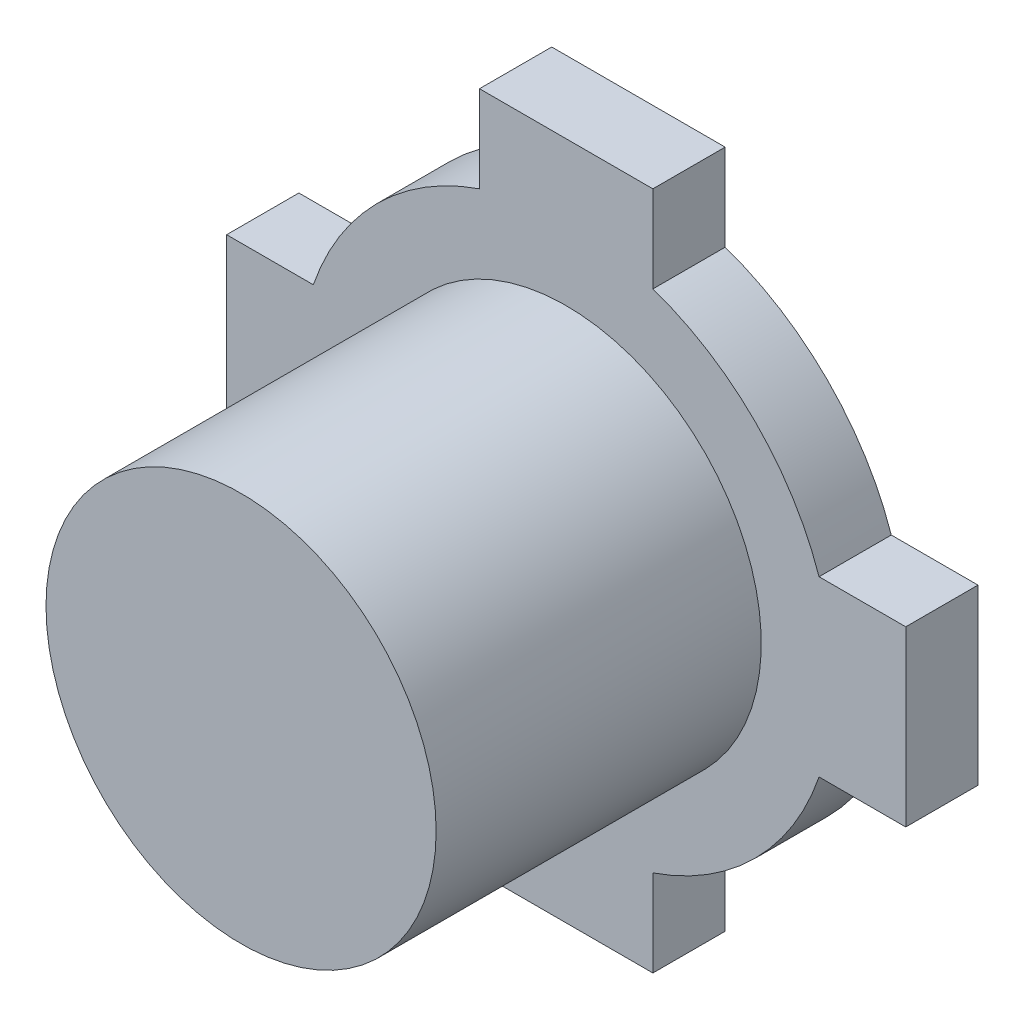
ISO-10303-21;
HEADER;
FILE_DESCRIPTION(('STEP AP214'),'2;1');
FILE_NAME('part.step','',(''),(''),'','','');
FILE_SCHEMA(('AUTOMOTIVE_DESIGN { 1 0 10303 214 1 1 1 1 }'));
ENDSEC;
DATA;
#1=APPLICATION_CONTEXT('core data for automotive mechanical design processes');
#2=APPLICATION_PROTOCOL_DEFINITION('international standard','automotive_design',2000,#1);
#3=PRODUCT_CONTEXT('',#1,'mechanical');
#4=PRODUCT('Part','Part','',(#3));
#5=PRODUCT_RELATED_PRODUCT_CATEGORY('part','',(#4));
#6=PRODUCT_DEFINITION_FORMATION('','',#4);
#7=PRODUCT_DEFINITION_CONTEXT('part definition',#1,'design');
#8=PRODUCT_DEFINITION('design','',#6,#7);
#9=PRODUCT_DEFINITION_SHAPE('','',#8);
#10=(LENGTH_UNIT() NAMED_UNIT(*) SI_UNIT(.MILLI.,.METRE.));
#11=(NAMED_UNIT(*) PLANE_ANGLE_UNIT() SI_UNIT($,.RADIAN.));
#12=(NAMED_UNIT(*) SI_UNIT($,.STERADIAN.) SOLID_ANGLE_UNIT());
#13=UNCERTAINTY_MEASURE_WITH_UNIT(LENGTH_MEASURE(1.E-05),#10,'distance_accuracy_value','');
#14=(GEOMETRIC_REPRESENTATION_CONTEXT(3) GLOBAL_UNCERTAINTY_ASSIGNED_CONTEXT((#13)) GLOBAL_UNIT_ASSIGNED_CONTEXT((#10,
#11,#12)) REPRESENTATION_CONTEXT('',''));
#15=CARTESIAN_POINT('',(0.,0.,0.));
#16=DIRECTION('',(0.,0.,1.));
#17=DIRECTION('',(1.,0.,0.));
#18=AXIS2_PLACEMENT_3D('',#15,#16,#17);
#19=CARTESIAN_POINT('',(0.,0.,4.5));
#20=DIRECTION('',(0.,0.,-1.));
#21=DIRECTION('',(-1.,0.,0.));
#22=AXIS2_PLACEMENT_3D('',#19,#20,#21);
#23=CYLINDRICAL_SURFACE('',#22,2.70000000000001);
#24=CARTESIAN_POINT('',(0.,0.,4.5));
#25=DIRECTION('',(0.,0.,1.));
#26=DIRECTION('',(1.,0.,0.));
#27=AXIS2_PLACEMENT_3D('',#24,#25,#26);
#28=CIRCLE('',#27,2.70000000000001);
#29=CARTESIAN_POINT('',(2.70000000000001,0.,4.5));
#30=VERTEX_POINT('',#29);
#31=EDGE_CURVE('E11',#30,#30,#28,.T.);
#32=ORIENTED_EDGE('',*,*,#31,.F.);
#33=EDGE_LOOP('',(#32));
#34=FACE_BOUND('',#33,.T.);
#35=CARTESIAN_POINT('',(0.,0.,0.));
#36=DIRECTION('',(0.,0.,-1.));
#37=DIRECTION('',(-1.,0.,0.));
#38=AXIS2_PLACEMENT_3D('',#35,#36,#37);
#39=CIRCLE('',#38,2.70000000000001);
#40=CARTESIAN_POINT('',(-2.70000000000001,0.,0.));
#41=VERTEX_POINT('',#40);
#42=EDGE_CURVE('E41',#41,#41,#39,.T.);
#43=ORIENTED_EDGE('',*,*,#42,.F.);
#44=EDGE_LOOP('',(#43));
#45=FACE_BOUND('',#44,.T.);
#46=ADVANCED_FACE('F33',(#34,#45),#23,.T.);
#47=CARTESIAN_POINT('',(0.,0.,4.5));
#48=DIRECTION('',(0.,0.,1.));
#49=DIRECTION('',(1.,0.,0.));
#50=AXIS2_PLACEMENT_3D('',#47,#48,#49);
#51=PLANE('',#50);
#52=ORIENTED_EDGE('',*,*,#31,.T.);
#53=EDGE_LOOP('',(#52));
#54=FACE_BOUND('',#53,.T.);
#55=ADVANCED_FACE('F253',(#54),#51,.T.);
#56=CARTESIAN_POINT('',(0.,0.,-1.));
#57=DIRECTION('',(0.,0.,1.));
#58=DIRECTION('',(1.,0.,0.));
#59=AXIS2_PLACEMENT_3D('',#56,#57,#58);
#60=CYLINDRICAL_SURFACE('',#59,3.70000000000001);
#61=CARTESIAN_POINT('',(0.,0.,0.));
#62=DIRECTION('',(0.,0.,-1.));
#63=DIRECTION('',(-1.,0.,0.));
#64=AXIS2_PLACEMENT_3D('',#61,#62,#63);
#65=CIRCLE('',#64,3.70000000000001);
#66=CARTESIAN_POINT('',(1.2,3.50000000000001,0.));
#67=VERTEX_POINT('',#66);
#68=CARTESIAN_POINT('',(3.50000000000001,1.2,0.));
#69=VERTEX_POINT('',#68);
#70=EDGE_CURVE('E178',#67,#69,#65,.T.);
#71=ORIENTED_EDGE('',*,*,#70,.T.);
#72=DIRECTION('',(0.,0.,1.));
#73=VECTOR('',#72,1.);
#74=CARTESIAN_POINT('',(3.50000000000001,1.2,-1.));
#75=LINE('',#74,#73);
#76=CARTESIAN_POINT('',(3.50000000000001,1.2,-1.));
#77=VERTEX_POINT('',#76);
#78=EDGE_CURVE('E245',#77,#69,#75,.T.);
#79=ORIENTED_EDGE('',*,*,#78,.F.);
#80=CARTESIAN_POINT('',(0.,0.,-1.));
#81=DIRECTION('',(0.,0.,-1.));
#82=DIRECTION('',(-1.,0.,0.));
#83=AXIS2_PLACEMENT_3D('',#80,#81,#82);
#84=CIRCLE('',#83,3.70000000000001);
#85=CARTESIAN_POINT('',(1.2,3.50000000000001,-1.));
#86=VERTEX_POINT('',#85);
#87=EDGE_CURVE('E208',#86,#77,#84,.T.);
#88=ORIENTED_EDGE('',*,*,#87,.F.);
#89=DIRECTION('',(0.,0.,1.));
#90=VECTOR('',#89,1.);
#91=CARTESIAN_POINT('',(1.2,3.50000000000001,-1.));
#92=LINE('',#91,#90);
#93=EDGE_CURVE('E174',#86,#67,#92,.T.);
#94=ORIENTED_EDGE('',*,*,#93,.T.);
#95=EDGE_LOOP('',(#71,#79,#88,#94));
#96=FACE_BOUND('',#95,.T.);
#97=ADVANCED_FACE('F258',(#96),#60,.T.);
#98=CARTESIAN_POINT('',(3.50000000000001,1.2,-1.));
#99=DIRECTION('',(0.,-1.,0.));
#100=DIRECTION('',(1.,0.,0.));
#101=AXIS2_PLACEMENT_3D('',#98,#99,#100);
#102=PLANE('',#101);
#103=DIRECTION('',(1.,0.,0.));
#104=VECTOR('',#103,1.);
#105=CARTESIAN_POINT('',(3.50000000000001,1.2,0.));
#106=LINE('',#105,#104);
#107=CARTESIAN_POINT('',(4.70000000000001,1.2,0.));
#108=VERTEX_POINT('',#107);
#109=EDGE_CURVE('E181',#69,#108,#106,.T.);
#110=ORIENTED_EDGE('',*,*,#109,.T.);
#111=DIRECTION('',(0.,0.,1.));
#112=VECTOR('',#111,1.);
#113=CARTESIAN_POINT('',(4.70000000000001,1.2,-1.));
#114=LINE('',#113,#112);
#115=CARTESIAN_POINT('',(4.70000000000001,1.2,-1.));
#116=VERTEX_POINT('',#115);
#117=EDGE_CURVE('E242',#116,#108,#114,.T.);
#118=ORIENTED_EDGE('',*,*,#117,.F.);
#119=DIRECTION('',(1.,0.,0.));
#120=VECTOR('',#119,1.);
#121=CARTESIAN_POINT('',(3.50000000000001,1.2,-1.));
#122=LINE('',#121,#120);
#123=EDGE_CURVE('E117',#77,#116,#122,.T.);
#124=ORIENTED_EDGE('',*,*,#123,.F.);
#125=ORIENTED_EDGE('',*,*,#78,.T.);
#126=EDGE_LOOP('',(#110,#118,#124,#125));
#127=FACE_BOUND('',#126,.T.);
#128=ADVANCED_FACE('F264',(#127),#102,.F.);
#129=CARTESIAN_POINT('',(4.70000000000001,1.2,-1.));
#130=DIRECTION('',(-1.,0.,0.));
#131=DIRECTION('',(0.,0.,1.));
#132=AXIS2_PLACEMENT_3D('',#129,#130,#131);
#133=PLANE('',#132);
#134=DIRECTION('',(0.,-1.,0.));
#135=VECTOR('',#134,1.);
#136=CARTESIAN_POINT('',(4.70000000000001,1.2,0.));
#137=LINE('',#136,#135);
#138=CARTESIAN_POINT('',(4.70000000000001,-1.2,0.));
#139=VERTEX_POINT('',#138);
#140=EDGE_CURVE('E183',#108,#139,#137,.T.);
#141=ORIENTED_EDGE('',*,*,#140,.T.);
#142=DIRECTION('',(0.,0.,1.));
#143=VECTOR('',#142,1.);
#144=CARTESIAN_POINT('',(4.70000000000001,-1.2,-1.));
#145=LINE('',#144,#143);
#146=CARTESIAN_POINT('',(4.70000000000001,-1.2,-1.));
#147=VERTEX_POINT('',#146);
#148=EDGE_CURVE('E239',#147,#139,#145,.T.);
#149=ORIENTED_EDGE('',*,*,#148,.F.);
#150=DIRECTION('',(0.,-1.,0.));
#151=VECTOR('',#150,1.);
#152=CARTESIAN_POINT('',(4.70000000000001,1.2,-1.));
#153=LINE('',#152,#151);
#154=EDGE_CURVE('E448',#116,#147,#153,.T.);
#155=ORIENTED_EDGE('',*,*,#154,.F.);
#156=ORIENTED_EDGE('',*,*,#117,.T.);
#157=EDGE_LOOP('',(#141,#149,#155,#156));
#158=FACE_BOUND('',#157,.T.);
#159=ADVANCED_FACE('F270',(#158),#133,.F.);
#160=CARTESIAN_POINT('',(4.70000000000001,-1.2,-1.));
#161=DIRECTION('',(0.,1.,0.));
#162=DIRECTION('',(-1.,0.,0.));
#163=AXIS2_PLACEMENT_3D('',#160,#161,#162);
#164=PLANE('',#163);
#165=DIRECTION('',(-1.,0.,0.));
#166=VECTOR('',#165,1.);
#167=CARTESIAN_POINT('',(4.70000000000001,-1.2,0.));
#168=LINE('',#167,#166);
#169=CARTESIAN_POINT('',(3.50000000000001,-1.2,0.));
#170=VERTEX_POINT('',#169);
#171=EDGE_CURVE('E185',#139,#170,#168,.T.);
#172=ORIENTED_EDGE('',*,*,#171,.T.);
#173=DIRECTION('',(0.,0.,1.));
#174=VECTOR('',#173,1.);
#175=CARTESIAN_POINT('',(3.50000000000001,-1.2,-1.));
#176=LINE('',#175,#174);
#177=CARTESIAN_POINT('',(3.50000000000001,-1.2,-1.));
#178=VERTEX_POINT('',#177);
#179=EDGE_CURVE('E236',#178,#170,#176,.T.);
#180=ORIENTED_EDGE('',*,*,#179,.F.);
#181=DIRECTION('',(-1.,0.,0.));
#182=VECTOR('',#181,1.);
#183=CARTESIAN_POINT('',(4.70000000000001,-1.2,-1.));
#184=LINE('',#183,#182);
#185=EDGE_CURVE('E452',#147,#178,#184,.T.);
#186=ORIENTED_EDGE('',*,*,#185,.F.);
#187=ORIENTED_EDGE('',*,*,#148,.T.);
#188=EDGE_LOOP('',(#172,#180,#186,#187));
#189=FACE_BOUND('',#188,.T.);
#190=ADVANCED_FACE('F273',(#189),#164,.F.);
#191=CARTESIAN_POINT('',(0.,0.,-1.));
#192=DIRECTION('',(0.,0.,1.));
#193=DIRECTION('',(1.,0.,0.));
#194=AXIS2_PLACEMENT_3D('',#191,#192,#193);
#195=CYLINDRICAL_SURFACE('',#194,3.70000000000001);
#196=CARTESIAN_POINT('',(0.,0.,0.));
#197=DIRECTION('',(0.,0.,-1.));
#198=DIRECTION('',(-1.,0.,0.));
#199=AXIS2_PLACEMENT_3D('',#196,#197,#198);
#200=CIRCLE('',#199,3.70000000000001);
#201=CARTESIAN_POINT('',(1.2,-3.50000000000001,0.));
#202=VERTEX_POINT('',#201);
#203=EDGE_CURVE('E187',#170,#202,#200,.T.);
#204=ORIENTED_EDGE('',*,*,#203,.T.);
#205=DIRECTION('',(0.,0.,1.));
#206=VECTOR('',#205,1.);
#207=CARTESIAN_POINT('',(1.2,-3.50000000000001,-1.));
#208=LINE('',#207,#206);
#209=CARTESIAN_POINT('',(1.2,-3.50000000000001,-1.));
#210=VERTEX_POINT('',#209);
#211=EDGE_CURVE('E233',#210,#202,#208,.T.);
#212=ORIENTED_EDGE('',*,*,#211,.F.);
#213=CARTESIAN_POINT('',(0.,0.,-1.));
#214=DIRECTION('',(0.,0.,-1.));
#215=DIRECTION('',(-1.,0.,0.));
#216=AXIS2_PLACEMENT_3D('',#213,#214,#215);
#217=CIRCLE('',#216,3.70000000000001);
#218=EDGE_CURVE('E454',#178,#210,#217,.T.);
#219=ORIENTED_EDGE('',*,*,#218,.F.);
#220=ORIENTED_EDGE('',*,*,#179,.T.);
#221=EDGE_LOOP('',(#204,#212,#219,#220));
#222=FACE_BOUND('',#221,.T.);
#223=ADVANCED_FACE('F277',(#222),#195,.T.);
#224=CARTESIAN_POINT('',(1.2,-3.50000000000001,-1.));
#225=DIRECTION('',(-1.,0.,0.));
#226=DIRECTION('',(0.,0.,1.));
#227=AXIS2_PLACEMENT_3D('',#224,#225,#226);
#228=PLANE('',#227);
#229=DIRECTION('',(0.,-1.,0.));
#230=VECTOR('',#229,1.);
#231=CARTESIAN_POINT('',(1.2,-3.50000000000001,0.));
#232=LINE('',#231,#230);
#233=CARTESIAN_POINT('',(1.2,-4.7,0.));
#234=VERTEX_POINT('',#233);
#235=EDGE_CURVE('E189',#202,#234,#232,.T.);
#236=ORIENTED_EDGE('',*,*,#235,.T.);
#237=DIRECTION('',(0.,0.,1.));
#238=VECTOR('',#237,1.);
#239=CARTESIAN_POINT('',(1.2,-4.7,-1.));
#240=LINE('',#239,#238);
#241=CARTESIAN_POINT('',(1.2,-4.7,-1.));
#242=VERTEX_POINT('',#241);
#243=EDGE_CURVE('E230',#242,#234,#240,.T.);
#244=ORIENTED_EDGE('',*,*,#243,.F.);
#245=DIRECTION('',(0.,-1.,0.));
#246=VECTOR('',#245,1.);
#247=CARTESIAN_POINT('',(1.2,-3.50000000000001,-1.));
#248=LINE('',#247,#246);
#249=EDGE_CURVE('E456',#210,#242,#248,.T.);
#250=ORIENTED_EDGE('',*,*,#249,.F.);
#251=ORIENTED_EDGE('',*,*,#211,.T.);
#252=EDGE_LOOP('',(#236,#244,#250,#251));
#253=FACE_BOUND('',#252,.T.);
#254=ADVANCED_FACE('F281',(#253),#228,.F.);
#255=CARTESIAN_POINT('',(1.2,-4.7,-1.));
#256=DIRECTION('',(0.,1.,0.));
#257=DIRECTION('',(0.,0.,1.));
#258=AXIS2_PLACEMENT_3D('',#255,#256,#257);
#259=PLANE('',#258);
#260=DIRECTION('',(-1.,0.,0.));
#261=VECTOR('',#260,1.);
#262=CARTESIAN_POINT('',(1.2,-4.7,0.));
#263=LINE('',#262,#261);
#264=CARTESIAN_POINT('',(-1.2,-4.7,0.));
#265=VERTEX_POINT('',#264);
#266=EDGE_CURVE('E191',#234,#265,#263,.T.);
#267=ORIENTED_EDGE('',*,*,#266,.T.);
#268=DIRECTION('',(0.,0.,1.));
#269=VECTOR('',#268,1.);
#270=CARTESIAN_POINT('',(-1.2,-4.7,-1.));
#271=LINE('',#270,#269);
#272=CARTESIAN_POINT('',(-1.2,-4.7,-1.));
#273=VERTEX_POINT('',#272);
#274=EDGE_CURVE('E227',#273,#265,#271,.T.);
#275=ORIENTED_EDGE('',*,*,#274,.F.);
#276=DIRECTION('',(-1.,0.,0.));
#277=VECTOR('',#276,1.);
#278=CARTESIAN_POINT('',(1.2,-4.7,-1.));
#279=LINE('',#278,#277);
#280=EDGE_CURVE('E458',#242,#273,#279,.T.);
#281=ORIENTED_EDGE('',*,*,#280,.F.);
#282=ORIENTED_EDGE('',*,*,#243,.T.);
#283=EDGE_LOOP('',(#267,#275,#281,#282));
#284=FACE_BOUND('',#283,.T.);
#285=ADVANCED_FACE('F285',(#284),#259,.F.);
#286=CARTESIAN_POINT('',(-1.2,-4.7,-1.));
#287=DIRECTION('',(1.,0.,0.));
#288=DIRECTION('',(0.,0.,-1.));
#289=AXIS2_PLACEMENT_3D('',#286,#287,#288);
#290=PLANE('',#289);
#291=DIRECTION('',(0.,1.,0.));
#292=VECTOR('',#291,1.);
#293=CARTESIAN_POINT('',(-1.2,-4.7,0.));
#294=LINE('',#293,#292);
#295=CARTESIAN_POINT('',(-1.2,-3.50000000000001,0.));
#296=VERTEX_POINT('',#295);
#297=EDGE_CURVE('E193',#265,#296,#294,.T.);
#298=ORIENTED_EDGE('',*,*,#297,.T.);
#299=DIRECTION('',(0.,0.,1.));
#300=VECTOR('',#299,1.);
#301=CARTESIAN_POINT('',(-1.2,-3.50000000000001,-1.));
#302=LINE('',#301,#300);
#303=CARTESIAN_POINT('',(-1.2,-3.50000000000001,-1.));
#304=VERTEX_POINT('',#303);
#305=EDGE_CURVE('E224',#304,#296,#302,.T.);
#306=ORIENTED_EDGE('',*,*,#305,.F.);
#307=DIRECTION('',(0.,1.,0.));
#308=VECTOR('',#307,1.);
#309=CARTESIAN_POINT('',(-1.2,-4.7,-1.));
#310=LINE('',#309,#308);
#311=EDGE_CURVE('E460',#273,#304,#310,.T.);
#312=ORIENTED_EDGE('',*,*,#311,.F.);
#313=ORIENTED_EDGE('',*,*,#274,.T.);
#314=EDGE_LOOP('',(#298,#306,#312,#313));
#315=FACE_BOUND('',#314,.T.);
#316=ADVANCED_FACE('F289',(#315),#290,.F.);
#317=CARTESIAN_POINT('',(0.,0.,-1.));
#318=DIRECTION('',(0.,0.,1.));
#319=DIRECTION('',(1.,0.,0.));
#320=AXIS2_PLACEMENT_3D('',#317,#318,#319);
#321=CYLINDRICAL_SURFACE('',#320,3.70000000000001);
#322=CARTESIAN_POINT('',(0.,0.,0.));
#323=DIRECTION('',(0.,0.,-1.));
#324=DIRECTION('',(-1.,0.,0.));
#325=AXIS2_PLACEMENT_3D('',#322,#323,#324);
#326=CIRCLE('',#325,3.70000000000001);
#327=CARTESIAN_POINT('',(-3.50000000000001,-1.2,0.));
#328=VERTEX_POINT('',#327);
#329=EDGE_CURVE('E195',#296,#328,#326,.T.);
#330=ORIENTED_EDGE('',*,*,#329,.T.);
#331=DIRECTION('',(0.,0.,1.));
#332=VECTOR('',#331,1.);
#333=CARTESIAN_POINT('',(-3.50000000000001,-1.2,-1.));
#334=LINE('',#333,#332);
#335=CARTESIAN_POINT('',(-3.50000000000001,-1.2,-1.));
#336=VERTEX_POINT('',#335);
#337=EDGE_CURVE('E221',#336,#328,#334,.T.);
#338=ORIENTED_EDGE('',*,*,#337,.F.);
#339=CARTESIAN_POINT('',(0.,0.,-1.));
#340=DIRECTION('',(0.,0.,-1.));
#341=DIRECTION('',(-1.,0.,0.));
#342=AXIS2_PLACEMENT_3D('',#339,#340,#341);
#343=CIRCLE('',#342,3.70000000000001);
#344=EDGE_CURVE('E462',#304,#336,#343,.T.);
#345=ORIENTED_EDGE('',*,*,#344,.F.);
#346=ORIENTED_EDGE('',*,*,#305,.T.);
#347=EDGE_LOOP('',(#330,#338,#345,#346));
#348=FACE_BOUND('',#347,.T.);
#349=ADVANCED_FACE('F293',(#348),#321,.T.);
#350=CARTESIAN_POINT('',(-3.50000000000001,-1.2,-1.));
#351=DIRECTION('',(0.,1.,0.));
#352=DIRECTION('',(0.,0.,1.));
#353=AXIS2_PLACEMENT_3D('',#350,#351,#352);
#354=PLANE('',#353);
#355=DIRECTION('',(-1.,0.,0.));
#356=VECTOR('',#355,1.);
#357=CARTESIAN_POINT('',(-3.50000000000001,-1.2,0.));
#358=LINE('',#357,#356);
#359=CARTESIAN_POINT('',(-4.7,-1.2,0.));
#360=VERTEX_POINT('',#359);
#361=EDGE_CURVE('E197',#328,#360,#358,.T.);
#362=ORIENTED_EDGE('',*,*,#361,.T.);
#363=DIRECTION('',(0.,0.,1.));
#364=VECTOR('',#363,1.);
#365=CARTESIAN_POINT('',(-4.7,-1.2,-1.));
#366=LINE('',#365,#364);
#367=CARTESIAN_POINT('',(-4.7,-1.2,-1.));
#368=VERTEX_POINT('',#367);
#369=EDGE_CURVE('E218',#368,#360,#366,.T.);
#370=ORIENTED_EDGE('',*,*,#369,.F.);
#371=DIRECTION('',(-1.,0.,0.));
#372=VECTOR('',#371,1.);
#373=CARTESIAN_POINT('',(-3.50000000000001,-1.2,-1.));
#374=LINE('',#373,#372);
#375=EDGE_CURVE('E464',#336,#368,#374,.T.);
#376=ORIENTED_EDGE('',*,*,#375,.F.);
#377=ORIENTED_EDGE('',*,*,#337,.T.);
#378=EDGE_LOOP('',(#362,#370,#376,#377));
#379=FACE_BOUND('',#378,.T.);
#380=ADVANCED_FACE('F297',(#379),#354,.F.);
#381=CARTESIAN_POINT('',(-4.7,-1.2,-1.));
#382=DIRECTION('',(1.,0.,0.));
#383=DIRECTION('',(0.,0.,-1.));
#384=AXIS2_PLACEMENT_3D('',#381,#382,#383);
#385=PLANE('',#384);
#386=DIRECTION('',(0.,1.,0.));
#387=VECTOR('',#386,1.);
#388=CARTESIAN_POINT('',(-4.7,-1.2,0.));
#389=LINE('',#388,#387);
#390=CARTESIAN_POINT('',(-4.7,1.2,0.));
#391=VERTEX_POINT('',#390);
#392=EDGE_CURVE('E199',#360,#391,#389,.T.);
#393=ORIENTED_EDGE('',*,*,#392,.T.);
#394=DIRECTION('',(0.,0.,1.));
#395=VECTOR('',#394,1.);
#396=CARTESIAN_POINT('',(-4.7,1.2,-1.));
#397=LINE('',#396,#395);
#398=CARTESIAN_POINT('',(-4.7,1.2,-1.));
#399=VERTEX_POINT('',#398);
#400=EDGE_CURVE('E215',#399,#391,#397,.T.);
#401=ORIENTED_EDGE('',*,*,#400,.F.);
#402=DIRECTION('',(0.,1.,0.));
#403=VECTOR('',#402,1.);
#404=CARTESIAN_POINT('',(-4.7,-1.2,-1.));
#405=LINE('',#404,#403);
#406=EDGE_CURVE('E466',#368,#399,#405,.T.);
#407=ORIENTED_EDGE('',*,*,#406,.F.);
#408=ORIENTED_EDGE('',*,*,#369,.T.);
#409=EDGE_LOOP('',(#393,#401,#407,#408));
#410=FACE_BOUND('',#409,.T.);
#411=ADVANCED_FACE('F301',(#410),#385,.F.);
#412=CARTESIAN_POINT('',(-4.7,1.2,-1.));
#413=DIRECTION('',(0.,-1.,0.));
#414=DIRECTION('',(1.,0.,0.));
#415=AXIS2_PLACEMENT_3D('',#412,#413,#414);
#416=PLANE('',#415);
#417=DIRECTION('',(1.,0.,0.));
#418=VECTOR('',#417,1.);
#419=CARTESIAN_POINT('',(-4.7,1.2,0.));
#420=LINE('',#419,#418);
#421=CARTESIAN_POINT('',(-3.50000000000001,1.2,0.));
#422=VERTEX_POINT('',#421);
#423=EDGE_CURVE('E201',#391,#422,#420,.T.);
#424=ORIENTED_EDGE('',*,*,#423,.T.);
#425=DIRECTION('',(0.,0.,1.));
#426=VECTOR('',#425,1.);
#427=CARTESIAN_POINT('',(-3.50000000000001,1.2,-1.));
#428=LINE('',#427,#426);
#429=CARTESIAN_POINT('',(-3.50000000000001,1.2,-1.));
#430=VERTEX_POINT('',#429);
#431=EDGE_CURVE('E212',#430,#422,#428,.T.);
#432=ORIENTED_EDGE('',*,*,#431,.F.);
#433=DIRECTION('',(1.,0.,0.));
#434=VECTOR('',#433,1.);
#435=CARTESIAN_POINT('',(-4.7,1.2,-1.));
#436=LINE('',#435,#434);
#437=EDGE_CURVE('E468',#399,#430,#436,.T.);
#438=ORIENTED_EDGE('',*,*,#437,.F.);
#439=ORIENTED_EDGE('',*,*,#400,.T.);
#440=EDGE_LOOP('',(#424,#432,#438,#439));
#441=FACE_BOUND('',#440,.T.);
#442=ADVANCED_FACE('F305',(#441),#416,.F.);
#443=CARTESIAN_POINT('',(0.,0.,-1.));
#444=DIRECTION('',(0.,0.,1.));
#445=DIRECTION('',(1.,0.,0.));
#446=AXIS2_PLACEMENT_3D('',#443,#444,#445);
#447=CYLINDRICAL_SURFACE('',#446,3.70000000000001);
#448=CARTESIAN_POINT('',(0.,0.,0.));
#449=DIRECTION('',(0.,0.,-1.));
#450=DIRECTION('',(-1.,0.,0.));
#451=AXIS2_PLACEMENT_3D('',#448,#449,#450);
#452=CIRCLE('',#451,3.70000000000001);
#453=CARTESIAN_POINT('',(-1.2,3.50000000000001,0.));
#454=VERTEX_POINT('',#453);
#455=EDGE_CURVE('E203',#422,#454,#452,.T.);
#456=ORIENTED_EDGE('',*,*,#455,.T.);
#457=DIRECTION('',(0.,0.,1.));
#458=VECTOR('',#457,1.);
#459=CARTESIAN_POINT('',(-1.2,3.50000000000001,-1.));
#460=LINE('',#459,#458);
#461=CARTESIAN_POINT('',(-1.2,3.50000000000001,-1.));
#462=VERTEX_POINT('',#461);
#463=EDGE_CURVE('E169',#462,#454,#460,.T.);
#464=ORIENTED_EDGE('',*,*,#463,.F.);
#465=CARTESIAN_POINT('',(0.,0.,-1.));
#466=DIRECTION('',(0.,0.,-1.));
#467=DIRECTION('',(-1.,0.,0.));
#468=AXIS2_PLACEMENT_3D('',#465,#466,#467);
#469=CIRCLE('',#468,3.70000000000001);
#470=EDGE_CURVE('E160',#430,#462,#469,.T.);
#471=ORIENTED_EDGE('',*,*,#470,.F.);
#472=ORIENTED_EDGE('',*,*,#431,.T.);
#473=EDGE_LOOP('',(#456,#464,#471,#472));
#474=FACE_BOUND('',#473,.T.);
#475=ADVANCED_FACE('F309',(#474),#447,.T.);
#476=CARTESIAN_POINT('',(-1.2,3.50000000000001,-1.));
#477=DIRECTION('',(1.,0.,0.));
#478=DIRECTION('',(0.,0.,-1.));
#479=AXIS2_PLACEMENT_3D('',#476,#477,#478);
#480=PLANE('',#479);
#481=DIRECTION('',(0.,1.,0.));
#482=VECTOR('',#481,1.);
#483=CARTESIAN_POINT('',(-1.2,3.50000000000001,0.));
#484=LINE('',#483,#482);
#485=CARTESIAN_POINT('',(-1.2,4.69999999999999,0.));
#486=VERTEX_POINT('',#485);
#487=EDGE_CURVE('E168',#454,#486,#484,.T.);
#488=ORIENTED_EDGE('',*,*,#487,.T.);
#489=DIRECTION('',(0.,0.,1.));
#490=VECTOR('',#489,1.);
#491=CARTESIAN_POINT('',(-1.2,4.69999999999999,-1.));
#492=LINE('',#491,#490);
#493=CARTESIAN_POINT('',(-1.2,4.69999999999999,-1.));
#494=VERTEX_POINT('',#493);
#495=EDGE_CURVE('E165',#494,#486,#492,.T.);
#496=ORIENTED_EDGE('',*,*,#495,.F.);
#497=DIRECTION('',(0.,1.,0.));
#498=VECTOR('',#497,1.);
#499=CARTESIAN_POINT('',(-1.2,3.50000000000001,-1.));
#500=LINE('',#499,#498);
#501=EDGE_CURVE('E154',#462,#494,#500,.T.);
#502=ORIENTED_EDGE('',*,*,#501,.F.);
#503=ORIENTED_EDGE('',*,*,#463,.T.);
#504=EDGE_LOOP('',(#488,#496,#502,#503));
#505=FACE_BOUND('',#504,.T.);
#506=ADVANCED_FACE('F166',(#505),#480,.F.);
#507=CARTESIAN_POINT('',(-1.2,4.69999999999999,-1.));
#508=DIRECTION('',(0.,-1.,0.));
#509=DIRECTION('',(0.,0.,-1.));
#510=AXIS2_PLACEMENT_3D('',#507,#508,#509);
#511=PLANE('',#510);
#512=DIRECTION('',(1.,0.,0.));
#513=VECTOR('',#512,1.);
#514=CARTESIAN_POINT('',(-1.2,4.69999999999999,0.));
#515=LINE('',#514,#513);
#516=CARTESIAN_POINT('',(1.2,4.69999999999999,0.));
#517=VERTEX_POINT('',#516);
#518=EDGE_CURVE('E102',#486,#517,#515,.T.);
#519=ORIENTED_EDGE('',*,*,#518,.T.);
#520=DIRECTION('',(0.,0.,1.));
#521=VECTOR('',#520,1.);
#522=CARTESIAN_POINT('',(1.2,4.69999999999999,-1.));
#523=LINE('',#522,#521);
#524=CARTESIAN_POINT('',(1.2,4.69999999999999,-1.));
#525=VERTEX_POINT('',#524);
#526=EDGE_CURVE('E170',#525,#517,#523,.T.);
#527=ORIENTED_EDGE('',*,*,#526,.F.);
#528=DIRECTION('',(1.,0.,0.));
#529=VECTOR('',#528,1.);
#530=CARTESIAN_POINT('',(-1.2,4.69999999999999,-1.));
#531=LINE('',#530,#529);
#532=EDGE_CURVE('E158',#494,#525,#531,.T.);
#533=ORIENTED_EDGE('',*,*,#532,.F.);
#534=ORIENTED_EDGE('',*,*,#495,.T.);
#535=EDGE_LOOP('',(#519,#527,#533,#534));
#536=FACE_BOUND('',#535,.T.);
#537=ADVANCED_FACE('F172',(#536),#511,.F.);
#538=CARTESIAN_POINT('',(1.2,4.69999999999999,-1.));
#539=DIRECTION('',(-1.,0.,0.));
#540=DIRECTION('',(0.,0.,1.));
#541=AXIS2_PLACEMENT_3D('',#538,#539,#540);
#542=PLANE('',#541);
#543=DIRECTION('',(0.,-1.,0.));
#544=VECTOR('',#543,1.);
#545=CARTESIAN_POINT('',(1.2,4.69999999999999,0.));
#546=LINE('',#545,#544);
#547=EDGE_CURVE('E108',#517,#67,#546,.T.);
#548=ORIENTED_EDGE('',*,*,#547,.T.);
#549=ORIENTED_EDGE('',*,*,#93,.F.);
#550=DIRECTION('',(0.,-1.,0.));
#551=VECTOR('',#550,1.);
#552=CARTESIAN_POINT('',(1.2,4.69999999999999,-1.));
#553=LINE('',#552,#551);
#554=EDGE_CURVE('E49',#525,#86,#553,.T.);
#555=ORIENTED_EDGE('',*,*,#554,.F.);
#556=ORIENTED_EDGE('',*,*,#526,.T.);
#557=EDGE_LOOP('',(#548,#549,#555,#556));
#558=FACE_BOUND('',#557,.T.);
#559=ADVANCED_FACE('F318',(#558),#542,.F.);
#560=CARTESIAN_POINT('',(0.,0.,-1.));
#561=DIRECTION('',(0.,0.,-1.));
#562=DIRECTION('',(-1.,0.,0.));
#563=AXIS2_PLACEMENT_3D('',#560,#561,#562);
#564=PLANE('',#563);
#565=ORIENTED_EDGE('',*,*,#87,.T.);
#566=ORIENTED_EDGE('',*,*,#123,.T.);
#567=ORIENTED_EDGE('',*,*,#154,.T.);
#568=ORIENTED_EDGE('',*,*,#185,.T.);
#569=ORIENTED_EDGE('',*,*,#218,.T.);
#570=ORIENTED_EDGE('',*,*,#249,.T.);
#571=ORIENTED_EDGE('',*,*,#280,.T.);
#572=ORIENTED_EDGE('',*,*,#311,.T.);
#573=ORIENTED_EDGE('',*,*,#344,.T.);
#574=ORIENTED_EDGE('',*,*,#375,.T.);
#575=ORIENTED_EDGE('',*,*,#406,.T.);
#576=ORIENTED_EDGE('',*,*,#437,.T.);
#577=ORIENTED_EDGE('',*,*,#470,.T.);
#578=ORIENTED_EDGE('',*,*,#501,.T.);
#579=ORIENTED_EDGE('',*,*,#532,.T.);
#580=ORIENTED_EDGE('',*,*,#554,.T.);
#581=EDGE_LOOP('',(#565,#566,#567,#568,#569,#570,#571,#572,#573,#574,#575,#576,#577,#578,#579,#580));
#582=FACE_BOUND('',#581,.T.);
#583=ADVANCED_FACE('F156',(#582),#564,.T.);
#584=CARTESIAN_POINT('',(0.,0.,0.));
#585=DIRECTION('',(0.,0.,-1.));
#586=DIRECTION('',(-1.,0.,0.));
#587=AXIS2_PLACEMENT_3D('',#584,#585,#586);
#588=PLANE('',#587);
#589=ORIENTED_EDGE('',*,*,#42,.T.);
#590=EDGE_LOOP('',(#589));
#591=FACE_BOUND('',#590,.T.);
#592=ORIENTED_EDGE('',*,*,#70,.F.);
#593=ORIENTED_EDGE('',*,*,#547,.F.);
#594=ORIENTED_EDGE('',*,*,#518,.F.);
#595=ORIENTED_EDGE('',*,*,#487,.F.);
#596=ORIENTED_EDGE('',*,*,#455,.F.);
#597=ORIENTED_EDGE('',*,*,#423,.F.);
#598=ORIENTED_EDGE('',*,*,#392,.F.);
#599=ORIENTED_EDGE('',*,*,#361,.F.);
#600=ORIENTED_EDGE('',*,*,#329,.F.);
#601=ORIENTED_EDGE('',*,*,#297,.F.);
#602=ORIENTED_EDGE('',*,*,#266,.F.);
#603=ORIENTED_EDGE('',*,*,#235,.F.);
#604=ORIENTED_EDGE('',*,*,#203,.F.);
#605=ORIENTED_EDGE('',*,*,#171,.F.);
#606=ORIENTED_EDGE('',*,*,#140,.F.);
#607=ORIENTED_EDGE('',*,*,#109,.F.);
#608=EDGE_LOOP('',(#592,#593,#594,#595,#596,#597,#598,#599,#600,#601,#602,#603,#604,#605,#606,#607));
#609=FACE_BOUND('',#608,.T.);
#610=ADVANCED_FACE('F249',(#591,#609),#588,.F.);
#611=CLOSED_SHELL('',(#46,#55,#97,#128,#159,#190,#223,#254,#285,#316,#349,#380,#411,#442,#475,
#506,#537,#559,#583,#610));
#612=MANIFOLD_SOLID_BREP('B2',#611);
#613=ADVANCED_BREP_SHAPE_REPRESENTATION('',(#18,#612),#14);
#614=SHAPE_DEFINITION_REPRESENTATION(#9,#613);
ENDSEC;
END-ISO-10303-21;
